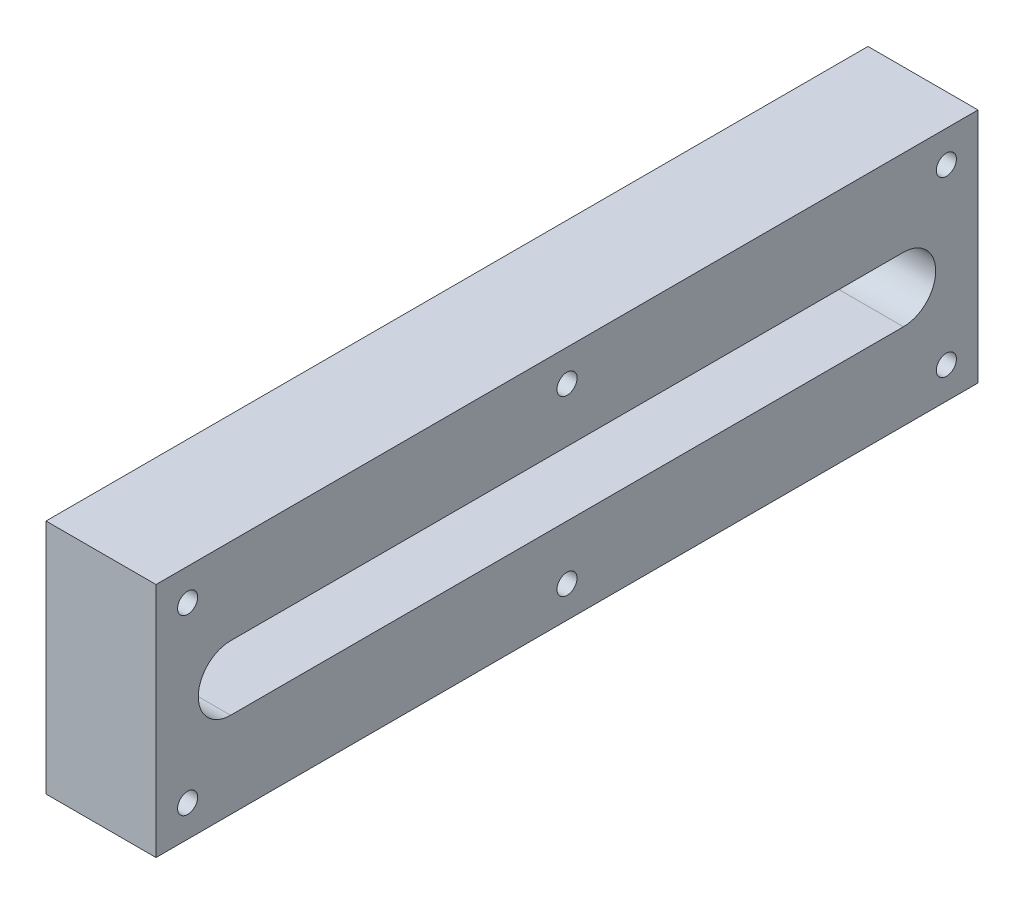
ISO-10303-21;
HEADER;
FILE_DESCRIPTION(('STEP AP214'),'2;1');
FILE_NAME('part.step','',(''),(''),'','','');
FILE_SCHEMA(('AUTOMOTIVE_DESIGN { 1 0 10303 214 1 1 1 1 }'));
ENDSEC;
DATA;
#1=APPLICATION_CONTEXT('core data for automotive mechanical design processes');
#2=APPLICATION_PROTOCOL_DEFINITION('international standard','automotive_design',2000,#1);
#3=PRODUCT_CONTEXT('',#1,'mechanical');
#4=PRODUCT('Part','Part','',(#3));
#5=PRODUCT_RELATED_PRODUCT_CATEGORY('part','',(#4));
#6=PRODUCT_DEFINITION_FORMATION('','',#4);
#7=PRODUCT_DEFINITION_CONTEXT('part definition',#1,'design');
#8=PRODUCT_DEFINITION('design','',#6,#7);
#9=PRODUCT_DEFINITION_SHAPE('','',#8);
#10=(LENGTH_UNIT() NAMED_UNIT(*) SI_UNIT(.MILLI.,.METRE.));
#11=(NAMED_UNIT(*) PLANE_ANGLE_UNIT() SI_UNIT($,.RADIAN.));
#12=(NAMED_UNIT(*) SI_UNIT($,.STERADIAN.) SOLID_ANGLE_UNIT());
#13=UNCERTAINTY_MEASURE_WITH_UNIT(LENGTH_MEASURE(1.E-05),#10,'distance_accuracy_value','');
#14=(GEOMETRIC_REPRESENTATION_CONTEXT(3) GLOBAL_UNCERTAINTY_ASSIGNED_CONTEXT((#13)) GLOBAL_UNIT_ASSIGNED_CONTEXT((#10,
#11,#12)) REPRESENTATION_CONTEXT('',''));
#15=CARTESIAN_POINT('',(0.,0.,0.));
#16=DIRECTION('',(0.,0.,1.));
#17=DIRECTION('',(1.,0.,0.));
#18=AXIS2_PLACEMENT_3D('',#15,#16,#17);
#19=CARTESIAN_POINT('',(22.098,0.,67.5752522));
#20=DIRECTION('',(-1.,0.,0.));
#21=DIRECTION('',(0.,0.,1.));
#22=AXIS2_PLACEMENT_3D('',#19,#20,#21);
#23=CYLINDRICAL_SURFACE('',#22,2.55270000000003);
#24=DIRECTION('',(-1.,0.,0.));
#25=VECTOR('',#24,1.);
#26=CARTESIAN_POINT('',(22.098,2.55270000000002,67.5752522));
#27=LINE('',#26,#25);
#28=CARTESIAN_POINT('',(3.848989,2.55270000000002,67.5752522));
#29=VERTEX_POINT('',#28);
#30=CARTESIAN_POINT('',(0.,2.55270000000002,67.5752522));
#31=VERTEX_POINT('',#30);
#32=EDGE_CURVE('E189',#29,#31,#27,.T.);
#33=ORIENTED_EDGE('',*,*,#32,.F.);
#34=CARTESIAN_POINT('',(3.848989,0.,67.5752522));
#35=DIRECTION('',(1.,0.,0.));
#36=DIRECTION('',(0.,0.,-1.));
#37=AXIS2_PLACEMENT_3D('',#34,#35,#36);
#38=CIRCLE('',#37,2.55270000000003);
#39=CARTESIAN_POINT('',(3.848989,-2.55270000000003,67.5752522));
#40=VERTEX_POINT('',#39);
#41=EDGE_CURVE('E70',#29,#40,#38,.T.);
#42=ORIENTED_EDGE('',*,*,#41,.T.);
#43=DIRECTION('',(-1.,0.,0.));
#44=VECTOR('',#43,1.);
#45=CARTESIAN_POINT('',(22.098,-2.55270000000003,67.5752522));
#46=LINE('',#45,#44);
#47=CARTESIAN_POINT('',(0.,-2.55270000000003,67.5752522));
#48=VERTEX_POINT('',#47);
#49=EDGE_CURVE('E195',#40,#48,#46,.T.);
#50=ORIENTED_EDGE('',*,*,#49,.T.);
#51=CARTESIAN_POINT('',(0.,0.,67.5752522));
#52=DIRECTION('',(1.,0.,0.));
#53=DIRECTION('',(0.,0.,-1.));
#54=AXIS2_PLACEMENT_3D('',#51,#52,#53);
#55=CIRCLE('',#54,2.55270000000003);
#56=EDGE_CURVE('E177',#31,#48,#55,.T.);
#57=ORIENTED_EDGE('',*,*,#56,.F.);
#58=EDGE_LOOP('',(#33,#42,#50,#57));
#59=FACE_BOUND('',#58,.T.);
#60=ADVANCED_FACE('F47',(#59),#23,.F.);
#61=CARTESIAN_POINT('',(22.098,-2.55270000000003,67.5752522));
#62=DIRECTION('',(0.,1.,0.));
#63=DIRECTION('',(0.,0.,1.));
#64=AXIS2_PLACEMENT_3D('',#61,#62,#63);
#65=PLANE('',#64);
#66=ORIENTED_EDGE('',*,*,#49,.F.);
#67=DIRECTION('',(0.,0.,-1.));
#68=VECTOR('',#67,1.);
#69=CARTESIAN_POINT('',(3.848989,-2.55270000000003,67.5752522));
#70=LINE('',#69,#68);
#71=CARTESIAN_POINT('',(3.848989,-2.5527,-67.5752522));
#72=VERTEX_POINT('',#71);
#73=EDGE_CURVE('E173',#40,#72,#70,.T.);
#74=ORIENTED_EDGE('',*,*,#73,.T.);
#75=DIRECTION('',(-1.,0.,0.));
#76=VECTOR('',#75,1.);
#77=CARTESIAN_POINT('',(22.098,-2.5527,-67.5752522));
#78=LINE('',#77,#76);
#79=CARTESIAN_POINT('',(0.,-2.5527,-67.5752522));
#80=VERTEX_POINT('',#79);
#81=EDGE_CURVE('E193',#72,#80,#78,.T.);
#82=ORIENTED_EDGE('',*,*,#81,.T.);
#83=DIRECTION('',(0.,0.,-1.));
#84=VECTOR('',#83,1.);
#85=CARTESIAN_POINT('',(0.,-2.55270000000003,67.5752522));
#86=LINE('',#85,#84);
#87=EDGE_CURVE('E180',#48,#80,#86,.T.);
#88=ORIENTED_EDGE('',*,*,#87,.F.);
#89=EDGE_LOOP('',(#66,#74,#82,#88));
#90=FACE_BOUND('',#89,.T.);
#91=ADVANCED_FACE('F261',(#90),#65,.T.);
#92=CARTESIAN_POINT('',(22.098,0.,-67.5752522));
#93=DIRECTION('',(-1.,0.,0.));
#94=DIRECTION('',(0.,0.,1.));
#95=AXIS2_PLACEMENT_3D('',#92,#93,#94);
#96=CYLINDRICAL_SURFACE('',#95,2.55270000000003);
#97=ORIENTED_EDGE('',*,*,#81,.F.);
#98=CARTESIAN_POINT('',(3.848989,0.,-67.5752522));
#99=DIRECTION('',(1.,0.,0.));
#100=DIRECTION('',(0.,0.,-1.));
#101=AXIS2_PLACEMENT_3D('',#98,#99,#100);
#102=CIRCLE('',#101,2.55270000000003);
#103=CARTESIAN_POINT('',(3.848989,2.55270000000005,-67.5752522));
#104=VERTEX_POINT('',#103);
#105=EDGE_CURVE('E169',#72,#104,#102,.T.);
#106=ORIENTED_EDGE('',*,*,#105,.T.);
#107=DIRECTION('',(-1.,0.,0.));
#108=VECTOR('',#107,1.);
#109=CARTESIAN_POINT('',(22.098,2.55270000000005,-67.5752522));
#110=LINE('',#109,#108);
#111=CARTESIAN_POINT('',(0.,2.55270000000005,-67.5752522));
#112=VERTEX_POINT('',#111);
#113=EDGE_CURVE('E191',#104,#112,#110,.T.);
#114=ORIENTED_EDGE('',*,*,#113,.T.);
#115=CARTESIAN_POINT('',(0.,0.,-67.5752522));
#116=DIRECTION('',(1.,0.,0.));
#117=DIRECTION('',(0.,0.,-1.));
#118=AXIS2_PLACEMENT_3D('',#115,#116,#117);
#119=CIRCLE('',#118,2.55270000000003);
#120=EDGE_CURVE('E183',#80,#112,#119,.T.);
#121=ORIENTED_EDGE('',*,*,#120,.F.);
#122=EDGE_LOOP('',(#97,#106,#114,#121));
#123=FACE_BOUND('',#122,.T.);
#124=ADVANCED_FACE('F254',(#123),#96,.F.);
#125=CARTESIAN_POINT('',(22.098,2.55270000000002,67.5752522));
#126=DIRECTION('',(0.,-1.,0.));
#127=DIRECTION('',(0.,0.,-1.));
#128=AXIS2_PLACEMENT_3D('',#125,#126,#127);
#129=PLANE('',#128);
#130=ORIENTED_EDGE('',*,*,#113,.F.);
#131=DIRECTION('',(0.,0.,1.));
#132=VECTOR('',#131,1.);
#133=CARTESIAN_POINT('',(3.848989,2.55270000000002,67.5752522));
#134=LINE('',#133,#132);
#135=EDGE_CURVE('E12',#104,#29,#134,.T.);
#136=ORIENTED_EDGE('',*,*,#135,.T.);
#137=ORIENTED_EDGE('',*,*,#32,.T.);
#138=DIRECTION('',(0.,0.,1.));
#139=VECTOR('',#138,1.);
#140=CARTESIAN_POINT('',(0.,2.55270000000002,67.5752522));
#141=LINE('',#140,#139);
#142=EDGE_CURVE('E186',#112,#31,#141,.T.);
#143=ORIENTED_EDGE('',*,*,#142,.F.);
#144=EDGE_LOOP('',(#130,#136,#137,#143));
#145=FACE_BOUND('',#144,.T.);
#146=ADVANCED_FACE('F245',(#145),#129,.T.);
#147=CARTESIAN_POINT('',(22.098,0.,0.));
#148=DIRECTION('',(1.,0.,0.));
#149=DIRECTION('',(0.,0.,-1.));
#150=AXIS2_PLACEMENT_3D('',#147,#148,#149);
#151=PLANE('',#150);
#152=CARTESIAN_POINT('',(22.098,17.399,76.2));
#153=DIRECTION('',(1.,0.,0.));
#154=DIRECTION('',(0.,0.,-1.));
#155=AXIS2_PLACEMENT_3D('',#152,#153,#154);
#156=CIRCLE('',#155,2.0193);
#157=CARTESIAN_POINT('',(22.098,17.399,74.1807));
#158=VERTEX_POINT('',#157);
#159=EDGE_CURVE('E317',#158,#158,#156,.T.);
#160=ORIENTED_EDGE('',*,*,#159,.F.);
#161=EDGE_LOOP('',(#160));
#162=FACE_BOUND('',#161,.T.);
#163=CARTESIAN_POINT('',(22.098,-17.399,76.2));
#164=DIRECTION('',(1.,0.,0.));
#165=DIRECTION('',(0.,0.,-1.));
#166=AXIS2_PLACEMENT_3D('',#163,#164,#165);
#167=CIRCLE('',#166,2.0193);
#168=CARTESIAN_POINT('',(22.098,-17.399,74.1807));
#169=VERTEX_POINT('',#168);
#170=EDGE_CURVE('E319',#169,#169,#167,.T.);
#171=ORIENTED_EDGE('',*,*,#170,.F.);
#172=EDGE_LOOP('',(#171));
#173=FACE_BOUND('',#172,.T.);
#174=CARTESIAN_POINT('',(22.098,-17.399,0.));
#175=DIRECTION('',(1.,0.,0.));
#176=DIRECTION('',(0.,0.,-1.));
#177=AXIS2_PLACEMENT_3D('',#174,#175,#176);
#178=CIRCLE('',#177,2.0193);
#179=CARTESIAN_POINT('',(22.098,-17.399,-2.0193));
#180=VERTEX_POINT('',#179);
#181=EDGE_CURVE('E327',#180,#180,#178,.T.);
#182=ORIENTED_EDGE('',*,*,#181,.F.);
#183=EDGE_LOOP('',(#182));
#184=FACE_BOUND('',#183,.T.);
#185=CARTESIAN_POINT('',(22.098,-17.399,-76.2));
#186=DIRECTION('',(1.,0.,0.));
#187=DIRECTION('',(0.,0.,-1.));
#188=AXIS2_PLACEMENT_3D('',#185,#186,#187);
#189=CIRCLE('',#188,2.0193);
#190=CARTESIAN_POINT('',(22.098,-17.399,-78.2193));
#191=VERTEX_POINT('',#190);
#192=EDGE_CURVE('E333',#191,#191,#189,.T.);
#193=ORIENTED_EDGE('',*,*,#192,.F.);
#194=EDGE_LOOP('',(#193));
#195=FACE_BOUND('',#194,.T.);
#196=CARTESIAN_POINT('',(22.098,17.399,-76.2));
#197=DIRECTION('',(1.,0.,0.));
#198=DIRECTION('',(0.,0.,-1.));
#199=AXIS2_PLACEMENT_3D('',#196,#197,#198);
#200=CIRCLE('',#199,2.0193);
#201=CARTESIAN_POINT('',(22.098,17.399,-78.2193));
#202=VERTEX_POINT('',#201);
#203=EDGE_CURVE('E339',#202,#202,#200,.T.);
#204=ORIENTED_EDGE('',*,*,#203,.F.);
#205=EDGE_LOOP('',(#204));
#206=FACE_BOUND('',#205,.T.);
#207=CARTESIAN_POINT('',(22.098,17.399,0.));
#208=DIRECTION('',(1.,0.,0.));
#209=DIRECTION('',(0.,0.,-1.));
#210=AXIS2_PLACEMENT_3D('',#207,#208,#209);
#211=CIRCLE('',#210,2.0193);
#212=CARTESIAN_POINT('',(22.098,17.399,-2.0193));
#213=VERTEX_POINT('',#212);
#214=EDGE_CURVE('E345',#213,#213,#211,.T.);
#215=ORIENTED_EDGE('',*,*,#214,.F.);
#216=EDGE_LOOP('',(#215));
#217=FACE_BOUND('',#216,.T.);
#218=CARTESIAN_POINT('',(22.098,0.,67.5752522));
#219=DIRECTION('',(1.,0.,0.));
#220=DIRECTION('',(0.,0.,-1.));
#221=AXIS2_PLACEMENT_3D('',#218,#219,#220);
#222=CIRCLE('',#221,6.47975590000003);
#223=CARTESIAN_POINT('',(22.098,6.47975590000003,67.5752522));
#224=VERTEX_POINT('',#223);
#225=CARTESIAN_POINT('',(22.098,-6.47975590000003,67.5752522));
#226=VERTEX_POINT('',#225);
#227=EDGE_CURVE('E62',#224,#226,#222,.T.);
#228=ORIENTED_EDGE('',*,*,#227,.F.);
#229=DIRECTION('',(0.,0.,1.));
#230=VECTOR('',#229,1.);
#231=CARTESIAN_POINT('',(22.098,6.47975590000003,67.5752522));
#232=LINE('',#231,#230);
#233=CARTESIAN_POINT('',(22.098,6.47975590000005,-67.5752522));
#234=VERTEX_POINT('',#233);
#235=EDGE_CURVE('E158',#234,#224,#232,.T.);
#236=ORIENTED_EDGE('',*,*,#235,.F.);
#237=CARTESIAN_POINT('',(22.098,0.,-67.5752522));
#238=DIRECTION('',(1.,0.,0.));
#239=DIRECTION('',(0.,0.,-1.));
#240=AXIS2_PLACEMENT_3D('',#237,#238,#239);
#241=CIRCLE('',#240,6.47975590000003);
#242=CARTESIAN_POINT('',(22.098,-6.4797559,-67.5752522));
#243=VERTEX_POINT('',#242);
#244=EDGE_CURVE('E141',#243,#234,#241,.T.);
#245=ORIENTED_EDGE('',*,*,#244,.F.);
#246=DIRECTION('',(0.,0.,-1.));
#247=VECTOR('',#246,1.);
#248=CARTESIAN_POINT('',(22.098,-6.47975590000003,67.5752522));
#249=LINE('',#248,#247);
#250=EDGE_CURVE('E151',#226,#243,#249,.T.);
#251=ORIENTED_EDGE('',*,*,#250,.F.);
#252=EDGE_LOOP('',(#228,#236,#245,#251));
#253=FACE_BOUND('',#252,.T.);
#254=DIRECTION('',(0.,-1.,0.));
#255=VECTOR('',#254,1.);
#256=CARTESIAN_POINT('',(22.098,-23.749,82.55));
#257=LINE('',#256,#255);
#258=CARTESIAN_POINT('',(22.098,23.749,82.55));
#259=VERTEX_POINT('',#258);
#260=CARTESIAN_POINT('',(22.098,-23.749,82.55));
#261=VERTEX_POINT('',#260);
#262=EDGE_CURVE('E198',#259,#261,#257,.T.);
#263=ORIENTED_EDGE('',*,*,#262,.T.);
#264=DIRECTION('',(0.,0.,-1.));
#265=VECTOR('',#264,1.);
#266=CARTESIAN_POINT('',(22.098,-23.749,-82.55));
#267=LINE('',#266,#265);
#268=CARTESIAN_POINT('',(22.098,-23.749,-82.55));
#269=VERTEX_POINT('',#268);
#270=EDGE_CURVE('E201',#261,#269,#267,.T.);
#271=ORIENTED_EDGE('',*,*,#270,.T.);
#272=DIRECTION('',(0.,1.,0.));
#273=VECTOR('',#272,1.);
#274=CARTESIAN_POINT('',(22.098,-23.749,-82.55));
#275=LINE('',#274,#273);
#276=CARTESIAN_POINT('',(22.098,23.749,-82.55));
#277=VERTEX_POINT('',#276);
#278=EDGE_CURVE('E204',#269,#277,#275,.T.);
#279=ORIENTED_EDGE('',*,*,#278,.T.);
#280=DIRECTION('',(0.,0.,1.));
#281=VECTOR('',#280,1.);
#282=CARTESIAN_POINT('',(22.098,23.749,-82.55));
#283=LINE('',#282,#281);
#284=EDGE_CURVE('E206',#277,#259,#283,.T.);
#285=ORIENTED_EDGE('',*,*,#284,.T.);
#286=EDGE_LOOP('',(#263,#271,#279,#285));
#287=FACE_BOUND('',#286,.T.);
#288=ADVANCED_FACE('F155',(#162,#173,#184,#195,#206,#217,#253,#287),#151,.T.);
#289=CARTESIAN_POINT('',(0.,0.,0.));
#290=DIRECTION('',(1.,0.,0.));
#291=DIRECTION('',(0.,0.,-1.));
#292=AXIS2_PLACEMENT_3D('',#289,#290,#291);
#293=PLANE('',#292);
#294=CARTESIAN_POINT('',(0.,17.399,76.2));
#295=DIRECTION('',(1.,0.,0.));
#296=DIRECTION('',(0.,0.,-1.));
#297=AXIS2_PLACEMENT_3D('',#294,#295,#296);
#298=CIRCLE('',#297,2.01929999999999);
#299=CARTESIAN_POINT('',(0.,17.399,74.1807));
#300=VERTEX_POINT('',#299);
#301=EDGE_CURVE('E315',#300,#300,#298,.T.);
#302=ORIENTED_EDGE('',*,*,#301,.T.);
#303=EDGE_LOOP('',(#302));
#304=FACE_BOUND('',#303,.T.);
#305=CARTESIAN_POINT('',(0.,-17.399,76.2));
#306=DIRECTION('',(1.,0.,0.));
#307=DIRECTION('',(0.,0.,-1.));
#308=AXIS2_PLACEMENT_3D('',#305,#306,#307);
#309=CIRCLE('',#308,2.01929999999999);
#310=CARTESIAN_POINT('',(0.,-17.399,74.1807));
#311=VERTEX_POINT('',#310);
#312=EDGE_CURVE('E324',#311,#311,#309,.T.);
#313=ORIENTED_EDGE('',*,*,#312,.T.);
#314=EDGE_LOOP('',(#313));
#315=FACE_BOUND('',#314,.T.);
#316=CARTESIAN_POINT('',(0.,-17.399,0.));
#317=DIRECTION('',(1.,0.,0.));
#318=DIRECTION('',(0.,0.,-1.));
#319=AXIS2_PLACEMENT_3D('',#316,#317,#318);
#320=CIRCLE('',#319,2.01929999999999);
#321=CARTESIAN_POINT('',(0.,-17.399,-2.01929999999999));
#322=VERTEX_POINT('',#321);
#323=EDGE_CURVE('E330',#322,#322,#320,.T.);
#324=ORIENTED_EDGE('',*,*,#323,.T.);
#325=EDGE_LOOP('',(#324));
#326=FACE_BOUND('',#325,.T.);
#327=CARTESIAN_POINT('',(0.,-17.399,-76.2));
#328=DIRECTION('',(1.,0.,0.));
#329=DIRECTION('',(0.,0.,-1.));
#330=AXIS2_PLACEMENT_3D('',#327,#328,#329);
#331=CIRCLE('',#330,2.01929999999999);
#332=CARTESIAN_POINT('',(0.,-17.399,-78.2193));
#333=VERTEX_POINT('',#332);
#334=EDGE_CURVE('E336',#333,#333,#331,.T.);
#335=ORIENTED_EDGE('',*,*,#334,.T.);
#336=EDGE_LOOP('',(#335));
#337=FACE_BOUND('',#336,.T.);
#338=CARTESIAN_POINT('',(0.,17.399,-76.2));
#339=DIRECTION('',(1.,0.,0.));
#340=DIRECTION('',(0.,0.,-1.));
#341=AXIS2_PLACEMENT_3D('',#338,#339,#340);
#342=CIRCLE('',#341,2.01929999999999);
#343=CARTESIAN_POINT('',(0.,17.399,-78.2193));
#344=VERTEX_POINT('',#343);
#345=EDGE_CURVE('E342',#344,#344,#342,.T.);
#346=ORIENTED_EDGE('',*,*,#345,.T.);
#347=EDGE_LOOP('',(#346));
#348=FACE_BOUND('',#347,.T.);
#349=CARTESIAN_POINT('',(0.,17.399,0.));
#350=DIRECTION('',(1.,0.,0.));
#351=DIRECTION('',(0.,0.,-1.));
#352=AXIS2_PLACEMENT_3D('',#349,#350,#351);
#353=CIRCLE('',#352,2.01929999999999);
#354=CARTESIAN_POINT('',(0.,17.399,-2.01929999999999));
#355=VERTEX_POINT('',#354);
#356=EDGE_CURVE('E348',#355,#355,#353,.T.);
#357=ORIENTED_EDGE('',*,*,#356,.T.);
#358=EDGE_LOOP('',(#357));
#359=FACE_BOUND('',#358,.T.);
#360=DIRECTION('',(0.,-1.,0.));
#361=VECTOR('',#360,1.);
#362=CARTESIAN_POINT('',(0.,-23.749,82.55));
#363=LINE('',#362,#361);
#364=CARTESIAN_POINT('',(0.,23.749,82.55));
#365=VERTEX_POINT('',#364);
#366=CARTESIAN_POINT('',(0.,-23.749,82.55));
#367=VERTEX_POINT('',#366);
#368=EDGE_CURVE('E197',#365,#367,#363,.T.);
#369=ORIENTED_EDGE('',*,*,#368,.F.);
#370=DIRECTION('',(0.,0.,1.));
#371=VECTOR('',#370,1.);
#372=CARTESIAN_POINT('',(0.,23.749,-82.55));
#373=LINE('',#372,#371);
#374=CARTESIAN_POINT('',(0.,23.749,-82.55));
#375=VERTEX_POINT('',#374);
#376=EDGE_CURVE('E202',#375,#365,#373,.T.);
#377=ORIENTED_EDGE('',*,*,#376,.F.);
#378=DIRECTION('',(0.,1.,0.));
#379=VECTOR('',#378,1.);
#380=CARTESIAN_POINT('',(0.,-23.749,-82.55));
#381=LINE('',#380,#379);
#382=CARTESIAN_POINT('',(0.,-23.749,-82.55));
#383=VERTEX_POINT('',#382);
#384=EDGE_CURVE('E213',#383,#375,#381,.T.);
#385=ORIENTED_EDGE('',*,*,#384,.F.);
#386=DIRECTION('',(0.,0.,-1.));
#387=VECTOR('',#386,1.);
#388=CARTESIAN_POINT('',(0.,-23.749,-82.55));
#389=LINE('',#388,#387);
#390=EDGE_CURVE('E211',#367,#383,#389,.T.);
#391=ORIENTED_EDGE('',*,*,#390,.F.);
#392=EDGE_LOOP('',(#369,#377,#385,#391));
#393=FACE_BOUND('',#392,.T.);
#394=ORIENTED_EDGE('',*,*,#56,.T.);
#395=ORIENTED_EDGE('',*,*,#87,.T.);
#396=ORIENTED_EDGE('',*,*,#120,.T.);
#397=ORIENTED_EDGE('',*,*,#142,.T.);
#398=EDGE_LOOP('',(#394,#395,#396,#397));
#399=FACE_BOUND('',#398,.T.);
#400=ADVANCED_FACE('F234',(#304,#315,#326,#337,#348,#359,#393,#399),#293,.F.);
#401=CARTESIAN_POINT('',(22.098,-23.749,82.55));
#402=DIRECTION('',(0.,0.,-1.));
#403=DIRECTION('',(-1.,0.,0.));
#404=AXIS2_PLACEMENT_3D('',#401,#402,#403);
#405=PLANE('',#404);
#406=ORIENTED_EDGE('',*,*,#368,.T.);
#407=DIRECTION('',(-1.,0.,0.));
#408=VECTOR('',#407,1.);
#409=CARTESIAN_POINT('',(22.098,-23.749,82.55));
#410=LINE('',#409,#408);
#411=EDGE_CURVE('E55',#261,#367,#410,.T.);
#412=ORIENTED_EDGE('',*,*,#411,.F.);
#413=ORIENTED_EDGE('',*,*,#262,.F.);
#414=DIRECTION('',(-1.,0.,0.));
#415=VECTOR('',#414,1.);
#416=CARTESIAN_POINT('',(22.098,23.749,82.55));
#417=LINE('',#416,#415);
#418=EDGE_CURVE('E208',#259,#365,#417,.T.);
#419=ORIENTED_EDGE('',*,*,#418,.T.);
#420=EDGE_LOOP('',(#406,#412,#413,#419));
#421=FACE_BOUND('',#420,.T.);
#422=ADVANCED_FACE('F49',(#421),#405,.F.);
#423=CARTESIAN_POINT('',(22.098,-23.749,-82.55));
#424=DIRECTION('',(0.,1.,0.));
#425=DIRECTION('',(0.,0.,1.));
#426=AXIS2_PLACEMENT_3D('',#423,#424,#425);
#427=PLANE('',#426);
#428=ORIENTED_EDGE('',*,*,#390,.T.);
#429=DIRECTION('',(-1.,0.,0.));
#430=VECTOR('',#429,1.);
#431=CARTESIAN_POINT('',(22.098,-23.749,-82.55));
#432=LINE('',#431,#430);
#433=EDGE_CURVE('E221',#269,#383,#432,.T.);
#434=ORIENTED_EDGE('',*,*,#433,.F.);
#435=ORIENTED_EDGE('',*,*,#270,.F.);
#436=ORIENTED_EDGE('',*,*,#411,.T.);
#437=EDGE_LOOP('',(#428,#434,#435,#436));
#438=FACE_BOUND('',#437,.T.);
#439=ADVANCED_FACE('F226',(#438),#427,.F.);
#440=CARTESIAN_POINT('',(22.098,-23.749,-82.55));
#441=DIRECTION('',(0.,0.,1.));
#442=DIRECTION('',(0.,-1.,0.));
#443=AXIS2_PLACEMENT_3D('',#440,#441,#442);
#444=PLANE('',#443);
#445=ORIENTED_EDGE('',*,*,#384,.T.);
#446=DIRECTION('',(-1.,0.,0.));
#447=VECTOR('',#446,1.);
#448=CARTESIAN_POINT('',(22.098,23.749,-82.55));
#449=LINE('',#448,#447);
#450=EDGE_CURVE('E218',#277,#375,#449,.T.);
#451=ORIENTED_EDGE('',*,*,#450,.F.);
#452=ORIENTED_EDGE('',*,*,#278,.F.);
#453=ORIENTED_EDGE('',*,*,#433,.T.);
#454=EDGE_LOOP('',(#445,#451,#452,#453));
#455=FACE_BOUND('',#454,.T.);
#456=ADVANCED_FACE('F239',(#455),#444,.F.);
#457=CARTESIAN_POINT('',(22.098,23.749,-82.55));
#458=DIRECTION('',(0.,-1.,0.));
#459=DIRECTION('',(0.,0.,-1.));
#460=AXIS2_PLACEMENT_3D('',#457,#458,#459);
#461=PLANE('',#460);
#462=ORIENTED_EDGE('',*,*,#376,.T.);
#463=ORIENTED_EDGE('',*,*,#418,.F.);
#464=ORIENTED_EDGE('',*,*,#284,.F.);
#465=ORIENTED_EDGE('',*,*,#450,.T.);
#466=EDGE_LOOP('',(#462,#463,#464,#465));
#467=FACE_BOUND('',#466,.T.);
#468=ADVANCED_FACE('F243',(#467),#461,.F.);
#469=CARTESIAN_POINT('',(-148.675908757467,0.,67.5752522));
#470=DIRECTION('',(1.,0.,0.));
#471=DIRECTION('',(0.,0.,-1.));
#472=AXIS2_PLACEMENT_3D('',#469,#470,#471);
#473=CYLINDRICAL_SURFACE('',#472,6.47975590000003);
#474=CARTESIAN_POINT('',(3.848989,0.,67.5752522));
#475=DIRECTION('',(1.,0.,0.));
#476=DIRECTION('',(0.,0.,-1.));
#477=AXIS2_PLACEMENT_3D('',#474,#475,#476);
#478=CIRCLE('',#477,6.47975590000003);
#479=CARTESIAN_POINT('',(3.848989,-6.47975590000003,67.5752522));
#480=VERTEX_POINT('',#479);
#481=CARTESIAN_POINT('',(3.848989,6.47975590000003,67.5752522));
#482=VERTEX_POINT('',#481);
#483=EDGE_CURVE('E170',#480,#482,#478,.F.);
#484=ORIENTED_EDGE('',*,*,#483,.T.);
#485=DIRECTION('',(1.,0.,0.));
#486=VECTOR('',#485,1.);
#487=CARTESIAN_POINT('',(-148.675908757467,6.47975590000003,67.5752522));
#488=LINE('',#487,#486);
#489=EDGE_CURVE('E163',#482,#224,#488,.T.);
#490=ORIENTED_EDGE('',*,*,#489,.T.);
#491=ORIENTED_EDGE('',*,*,#227,.T.);
#492=DIRECTION('',(1.,0.,0.));
#493=VECTOR('',#492,1.);
#494=CARTESIAN_POINT('',(-148.675908757467,-6.47975590000003,67.5752522));
#495=LINE('',#494,#493);
#496=EDGE_CURVE('E148',#480,#226,#495,.T.);
#497=ORIENTED_EDGE('',*,*,#496,.F.);
#498=EDGE_LOOP('',(#484,#490,#491,#497));
#499=FACE_BOUND('',#498,.T.);
#500=ADVANCED_FACE('F273',(#499),#473,.F.);
#501=CARTESIAN_POINT('',(-148.675908757467,6.47975590000003,67.5752522));
#502=DIRECTION('',(0.,1.,0.));
#503=DIRECTION('',(0.,0.,1.));
#504=AXIS2_PLACEMENT_3D('',#501,#502,#503);
#505=PLANE('',#504);
#506=DIRECTION('',(0.,0.,-1.));
#507=VECTOR('',#506,1.);
#508=CARTESIAN_POINT('',(3.848989,6.47975590000003,67.5752522));
#509=LINE('',#508,#507);
#510=CARTESIAN_POINT('',(3.848989,6.47975590000005,-67.5752522));
#511=VERTEX_POINT('',#510);
#512=EDGE_CURVE('E352',#482,#511,#509,.T.);
#513=ORIENTED_EDGE('',*,*,#512,.T.);
#514=DIRECTION('',(1.,0.,0.));
#515=VECTOR('',#514,1.);
#516=CARTESIAN_POINT('',(-148.675908757467,6.47975590000005,-67.5752522));
#517=LINE('',#516,#515);
#518=EDGE_CURVE('E147',#511,#234,#517,.T.);
#519=ORIENTED_EDGE('',*,*,#518,.T.);
#520=ORIENTED_EDGE('',*,*,#235,.T.);
#521=ORIENTED_EDGE('',*,*,#489,.F.);
#522=EDGE_LOOP('',(#513,#519,#520,#521));
#523=FACE_BOUND('',#522,.T.);
#524=ADVANCED_FACE('F276',(#523),#505,.F.);
#525=CARTESIAN_POINT('',(-148.675908757467,0.,-67.5752522));
#526=DIRECTION('',(1.,0.,0.));
#527=DIRECTION('',(0.,0.,-1.));
#528=AXIS2_PLACEMENT_3D('',#525,#526,#527);
#529=CYLINDRICAL_SURFACE('',#528,6.47975590000003);
#530=CARTESIAN_POINT('',(3.848989,0.,-67.5752522));
#531=DIRECTION('',(1.,0.,0.));
#532=DIRECTION('',(0.,0.,-1.));
#533=AXIS2_PLACEMENT_3D('',#530,#531,#532);
#534=CIRCLE('',#533,6.47975590000003);
#535=CARTESIAN_POINT('',(3.848989,-6.4797559,-67.5752522));
#536=VERTEX_POINT('',#535);
#537=EDGE_CURVE('E144',#511,#536,#534,.F.);
#538=ORIENTED_EDGE('',*,*,#537,.T.);
#539=DIRECTION('',(1.,0.,0.));
#540=VECTOR('',#539,1.);
#541=CARTESIAN_POINT('',(-148.675908757467,-6.4797559,-67.5752522));
#542=LINE('',#541,#540);
#543=EDGE_CURVE('E136',#536,#243,#542,.T.);
#544=ORIENTED_EDGE('',*,*,#543,.T.);
#545=ORIENTED_EDGE('',*,*,#244,.T.);
#546=ORIENTED_EDGE('',*,*,#518,.F.);
#547=EDGE_LOOP('',(#538,#544,#545,#546));
#548=FACE_BOUND('',#547,.T.);
#549=ADVANCED_FACE('F138',(#548),#529,.F.);
#550=CARTESIAN_POINT('',(-148.675908757467,-6.47975590000003,67.5752522));
#551=DIRECTION('',(0.,-1.,0.));
#552=DIRECTION('',(0.,0.,-1.));
#553=AXIS2_PLACEMENT_3D('',#550,#551,#552);
#554=PLANE('',#553);
#555=DIRECTION('',(0.,0.,1.));
#556=VECTOR('',#555,1.);
#557=CARTESIAN_POINT('',(3.848989,-6.47975590000003,67.5752522));
#558=LINE('',#557,#556);
#559=EDGE_CURVE('E167',#536,#480,#558,.T.);
#560=ORIENTED_EDGE('',*,*,#559,.T.);
#561=ORIENTED_EDGE('',*,*,#496,.T.);
#562=ORIENTED_EDGE('',*,*,#250,.T.);
#563=ORIENTED_EDGE('',*,*,#543,.F.);
#564=EDGE_LOOP('',(#560,#561,#562,#563));
#565=FACE_BOUND('',#564,.T.);
#566=ADVANCED_FACE('F152',(#565),#554,.F.);
#567=CARTESIAN_POINT('',(3.848989,0.,0.));
#568=DIRECTION('',(1.,0.,0.));
#569=DIRECTION('',(0.,0.,-1.));
#570=AXIS2_PLACEMENT_3D('',#567,#568,#569);
#571=PLANE('',#570);
#572=ORIENTED_EDGE('',*,*,#135,.F.);
#573=ORIENTED_EDGE('',*,*,#105,.F.);
#574=ORIENTED_EDGE('',*,*,#73,.F.);
#575=ORIENTED_EDGE('',*,*,#41,.F.);
#576=EDGE_LOOP('',(#572,#573,#574,#575));
#577=FACE_BOUND('',#576,.T.);
#578=ORIENTED_EDGE('',*,*,#483,.F.);
#579=ORIENTED_EDGE('',*,*,#559,.F.);
#580=ORIENTED_EDGE('',*,*,#537,.F.);
#581=ORIENTED_EDGE('',*,*,#512,.F.);
#582=EDGE_LOOP('',(#578,#579,#580,#581));
#583=FACE_BOUND('',#582,.T.);
#584=ADVANCED_FACE('F279',(#577,#583),#571,.T.);
#585=CARTESIAN_POINT('',(22.098,17.399,0.));
#586=DIRECTION('',(1.,0.,0.));
#587=DIRECTION('',(0.,0.,-1.));
#588=AXIS2_PLACEMENT_3D('',#585,#586,#587);
#589=CYLINDRICAL_SURFACE('',#588,2.0193);
#590=ORIENTED_EDGE('',*,*,#356,.F.);
#591=EDGE_LOOP('',(#590));
#592=FACE_BOUND('',#591,.T.);
#593=ORIENTED_EDGE('',*,*,#214,.T.);
#594=EDGE_LOOP('',(#593));
#595=FACE_BOUND('',#594,.T.);
#596=ADVANCED_FACE('F287',(#592,#595),#589,.F.);
#597=CARTESIAN_POINT('',(22.098,17.399,-76.2));
#598=DIRECTION('',(1.,0.,0.));
#599=DIRECTION('',(0.,0.,-1.));
#600=AXIS2_PLACEMENT_3D('',#597,#598,#599);
#601=CYLINDRICAL_SURFACE('',#600,2.0193);
#602=ORIENTED_EDGE('',*,*,#345,.F.);
#603=EDGE_LOOP('',(#602));
#604=FACE_BOUND('',#603,.T.);
#605=ORIENTED_EDGE('',*,*,#203,.T.);
#606=EDGE_LOOP('',(#605));
#607=FACE_BOUND('',#606,.T.);
#608=ADVANCED_FACE('F290',(#604,#607),#601,.F.);
#609=CARTESIAN_POINT('',(22.098,-17.399,-76.2));
#610=DIRECTION('',(1.,0.,0.));
#611=DIRECTION('',(0.,0.,-1.));
#612=AXIS2_PLACEMENT_3D('',#609,#610,#611);
#613=CYLINDRICAL_SURFACE('',#612,2.0193);
#614=ORIENTED_EDGE('',*,*,#334,.F.);
#615=EDGE_LOOP('',(#614));
#616=FACE_BOUND('',#615,.T.);
#617=ORIENTED_EDGE('',*,*,#192,.T.);
#618=EDGE_LOOP('',(#617));
#619=FACE_BOUND('',#618,.T.);
#620=ADVANCED_FACE('F294',(#616,#619),#613,.F.);
#621=CARTESIAN_POINT('',(22.098,-17.399,0.));
#622=DIRECTION('',(1.,0.,0.));
#623=DIRECTION('',(0.,0.,-1.));
#624=AXIS2_PLACEMENT_3D('',#621,#622,#623);
#625=CYLINDRICAL_SURFACE('',#624,2.0193);
#626=ORIENTED_EDGE('',*,*,#323,.F.);
#627=EDGE_LOOP('',(#626));
#628=FACE_BOUND('',#627,.T.);
#629=ORIENTED_EDGE('',*,*,#181,.T.);
#630=EDGE_LOOP('',(#629));
#631=FACE_BOUND('',#630,.T.);
#632=ADVANCED_FACE('F298',(#628,#631),#625,.F.);
#633=CARTESIAN_POINT('',(22.098,-17.399,76.2));
#634=DIRECTION('',(1.,0.,0.));
#635=DIRECTION('',(0.,0.,-1.));
#636=AXIS2_PLACEMENT_3D('',#633,#634,#635);
#637=CYLINDRICAL_SURFACE('',#636,2.0193);
#638=ORIENTED_EDGE('',*,*,#312,.F.);
#639=EDGE_LOOP('',(#638));
#640=FACE_BOUND('',#639,.T.);
#641=ORIENTED_EDGE('',*,*,#170,.T.);
#642=EDGE_LOOP('',(#641));
#643=FACE_BOUND('',#642,.T.);
#644=ADVANCED_FACE('F302',(#640,#643),#637,.F.);
#645=CARTESIAN_POINT('',(22.098,17.399,76.2));
#646=DIRECTION('',(1.,0.,0.));
#647=DIRECTION('',(0.,0.,-1.));
#648=AXIS2_PLACEMENT_3D('',#645,#646,#647);
#649=CYLINDRICAL_SURFACE('',#648,2.0193);
#650=ORIENTED_EDGE('',*,*,#301,.F.);
#651=EDGE_LOOP('',(#650));
#652=FACE_BOUND('',#651,.T.);
#653=ORIENTED_EDGE('',*,*,#159,.T.);
#654=EDGE_LOOP('',(#653));
#655=FACE_BOUND('',#654,.T.);
#656=ADVANCED_FACE('F306',(#652,#655),#649,.F.);
#657=CLOSED_SHELL('',(#60,#91,#124,#146,#288,#400,#422,#439,#456,#468,#500,#524,#549,#566,#584,
#596,#608,#620,#632,#644,#656));
#658=MANIFOLD_SOLID_BREP('B2',#657);
#659=ADVANCED_BREP_SHAPE_REPRESENTATION('',(#18,#658),#14);
#660=SHAPE_DEFINITION_REPRESENTATION(#9,#659);
ENDSEC;
END-ISO-10303-21;
